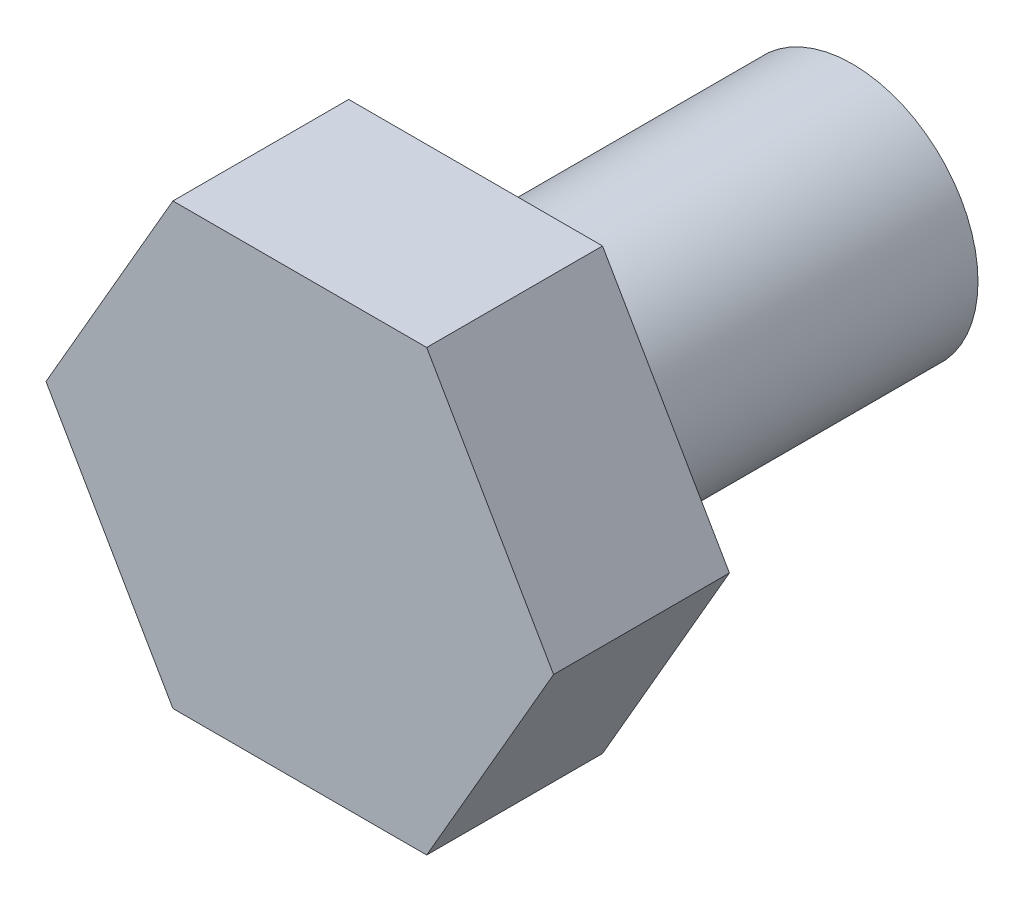
ISO-10303-21;
HEADER;
FILE_DESCRIPTION(('STEP AP214'),'2;1');
FILE_NAME('part.step','',(''),(''),'','','');
FILE_SCHEMA(('AUTOMOTIVE_DESIGN { 1 0 10303 214 1 1 1 1 }'));
ENDSEC;
DATA;
#1=APPLICATION_CONTEXT('core data for automotive mechanical design processes');
#2=APPLICATION_PROTOCOL_DEFINITION('international standard','automotive_design',2000,#1);
#3=PRODUCT_CONTEXT('',#1,'mechanical');
#4=PRODUCT('Part','Part','',(#3));
#5=PRODUCT_RELATED_PRODUCT_CATEGORY('part','',(#4));
#6=PRODUCT_DEFINITION_FORMATION('','',#4);
#7=PRODUCT_DEFINITION_CONTEXT('part definition',#1,'design');
#8=PRODUCT_DEFINITION('design','',#6,#7);
#9=PRODUCT_DEFINITION_SHAPE('','',#8);
#10=(LENGTH_UNIT() NAMED_UNIT(*) SI_UNIT(.MILLI.,.METRE.));
#11=(NAMED_UNIT(*) PLANE_ANGLE_UNIT() SI_UNIT($,.RADIAN.));
#12=(NAMED_UNIT(*) SI_UNIT($,.STERADIAN.) SOLID_ANGLE_UNIT());
#13=UNCERTAINTY_MEASURE_WITH_UNIT(LENGTH_MEASURE(1.E-05),#10,'distance_accuracy_value','');
#14=(GEOMETRIC_REPRESENTATION_CONTEXT(3) GLOBAL_UNCERTAINTY_ASSIGNED_CONTEXT((#13)) GLOBAL_UNIT_ASSIGNED_CONTEXT((#10,
#11,#12)) REPRESENTATION_CONTEXT('',''));
#15=CARTESIAN_POINT('',(0.,0.,0.));
#16=DIRECTION('',(0.,0.,1.));
#17=DIRECTION('',(1.,0.,0.));
#18=AXIS2_PLACEMENT_3D('',#15,#16,#17);
#19=CARTESIAN_POINT('',(0.,0.,-6.));
#20=DIRECTION('',(0.,0.,1.));
#21=DIRECTION('',(1.,0.,0.));
#22=AXIS2_PLACEMENT_3D('',#19,#20,#21);
#23=CYLINDRICAL_SURFACE('',#22,2.);
#24=CARTESIAN_POINT('',(0.,0.,-6.));
#25=DIRECTION('',(0.,0.,1.));
#26=DIRECTION('',(1.,0.,0.));
#27=AXIS2_PLACEMENT_3D('',#24,#25,#26);
#28=CIRCLE('',#27,2.);
#29=CARTESIAN_POINT('',(2.,0.,-6.));
#30=VERTEX_POINT('',#29);
#31=EDGE_CURVE('E11',#30,#30,#28,.T.);
#32=ORIENTED_EDGE('',*,*,#31,.T.);
#33=EDGE_LOOP('',(#32));
#34=FACE_BOUND('',#33,.T.);
#35=CARTESIAN_POINT('',(0.,0.,0.));
#36=DIRECTION('',(0.,0.,1.));
#37=DIRECTION('',(1.,0.,0.));
#38=AXIS2_PLACEMENT_3D('',#35,#36,#37);
#39=CIRCLE('',#38,2.);
#40=CARTESIAN_POINT('',(2.,0.,0.));
#41=VERTEX_POINT('',#40);
#42=EDGE_CURVE('E37',#41,#41,#39,.T.);
#43=ORIENTED_EDGE('',*,*,#42,.F.);
#44=EDGE_LOOP('',(#43));
#45=FACE_BOUND('',#44,.T.);
#46=ADVANCED_FACE('F34',(#34,#45),#23,.T.);
#47=CARTESIAN_POINT('',(0.,0.,-6.));
#48=DIRECTION('',(0.,0.,1.));
#49=DIRECTION('',(1.,0.,0.));
#50=AXIS2_PLACEMENT_3D('',#47,#48,#49);
#51=PLANE('',#50);
#52=ORIENTED_EDGE('',*,*,#31,.F.);
#53=EDGE_LOOP('',(#52));
#54=FACE_BOUND('',#53,.T.);
#55=ADVANCED_FACE('F145',(#54),#51,.F.);
#56=CARTESIAN_POINT('',(2.02072594216369,3.5,2.8));
#57=DIRECTION('',(0.,-1.,0.));
#58=DIRECTION('',(0.,0.,-1.));
#59=AXIS2_PLACEMENT_3D('',#56,#57,#58);
#60=PLANE('',#59);
#61=DIRECTION('',(-1.,0.,0.));
#62=VECTOR('',#61,1.);
#63=CARTESIAN_POINT('',(2.02072594216369,3.5,0.));
#64=LINE('',#63,#62);
#65=CARTESIAN_POINT('',(2.02072594216369,3.5,0.));
#66=VERTEX_POINT('',#65);
#67=CARTESIAN_POINT('',(-2.02072594216369,3.5,0.));
#68=VERTEX_POINT('',#67);
#69=EDGE_CURVE('E119',#66,#68,#64,.T.);
#70=ORIENTED_EDGE('',*,*,#69,.T.);
#71=DIRECTION('',(0.,0.,-1.));
#72=VECTOR('',#71,1.);
#73=CARTESIAN_POINT('',(-2.02072594216369,3.5,2.8));
#74=LINE('',#73,#72);
#75=CARTESIAN_POINT('',(-2.02072594216369,3.5,2.8));
#76=VERTEX_POINT('',#75);
#77=EDGE_CURVE('E136',#76,#68,#74,.T.);
#78=ORIENTED_EDGE('',*,*,#77,.F.);
#79=DIRECTION('',(-1.,0.,0.));
#80=VECTOR('',#79,1.);
#81=CARTESIAN_POINT('',(2.02072594216369,3.5,2.8));
#82=LINE('',#81,#80);
#83=CARTESIAN_POINT('',(2.02072594216369,3.5,2.8));
#84=VERTEX_POINT('',#83);
#85=EDGE_CURVE('E129',#84,#76,#82,.T.);
#86=ORIENTED_EDGE('',*,*,#85,.F.);
#87=DIRECTION('',(0.,0.,-1.));
#88=VECTOR('',#87,1.);
#89=CARTESIAN_POINT('',(2.02072594216369,3.5,2.8));
#90=LINE('',#89,#88);
#91=EDGE_CURVE('E115',#84,#66,#90,.T.);
#92=ORIENTED_EDGE('',*,*,#91,.T.);
#93=EDGE_LOOP('',(#70,#78,#86,#92));
#94=FACE_BOUND('',#93,.T.);
#95=ADVANCED_FACE('F150',(#94),#60,.F.);
#96=CARTESIAN_POINT('',(-2.02072594216369,3.5,2.8));
#97=DIRECTION('',(0.866025403784439,-0.5,0.));
#98=DIRECTION('',(0.5,0.866025403784439,0.));
#99=AXIS2_PLACEMENT_3D('',#96,#97,#98);
#100=PLANE('',#99);
#101=DIRECTION('',(-0.5,-0.866025403784439,0.));
#102=VECTOR('',#101,1.);
#103=CARTESIAN_POINT('',(-2.02072594216369,3.5,0.));
#104=LINE('',#103,#102);
#105=CARTESIAN_POINT('',(-4.04145188432738,0.,0.));
#106=VERTEX_POINT('',#105);
#107=EDGE_CURVE('E122',#68,#106,#104,.T.);
#108=ORIENTED_EDGE('',*,*,#107,.T.);
#109=DIRECTION('',(0.,0.,-1.));
#110=VECTOR('',#109,1.);
#111=CARTESIAN_POINT('',(-4.04145188432738,0.,2.8));
#112=LINE('',#111,#110);
#113=CARTESIAN_POINT('',(-4.04145188432738,0.,2.8));
#114=VERTEX_POINT('',#113);
#115=EDGE_CURVE('E133',#114,#106,#112,.T.);
#116=ORIENTED_EDGE('',*,*,#115,.F.);
#117=DIRECTION('',(-0.5,-0.866025403784439,0.));
#118=VECTOR('',#117,1.);
#119=CARTESIAN_POINT('',(-2.02072594216369,3.5,2.8));
#120=LINE('',#119,#118);
#121=EDGE_CURVE('E88',#76,#114,#120,.T.);
#122=ORIENTED_EDGE('',*,*,#121,.F.);
#123=ORIENTED_EDGE('',*,*,#77,.T.);
#124=EDGE_LOOP('',(#108,#116,#122,#123));
#125=FACE_BOUND('',#124,.T.);
#126=ADVANCED_FACE('F156',(#125),#100,.F.);
#127=CARTESIAN_POINT('',(-4.04145188432738,0.,2.8));
#128=DIRECTION('',(0.866025403784439,0.5,0.));
#129=DIRECTION('',(-0.5,0.866025403784439,0.));
#130=AXIS2_PLACEMENT_3D('',#127,#128,#129);
#131=PLANE('',#130);
#132=DIRECTION('',(0.5,-0.866025403784439,0.));
#133=VECTOR('',#132,1.);
#134=CARTESIAN_POINT('',(-4.04145188432738,0.,0.));
#135=LINE('',#134,#133);
#136=CARTESIAN_POINT('',(-2.02072594216369,-3.5,0.));
#137=VERTEX_POINT('',#136);
#138=EDGE_CURVE('E124',#106,#137,#135,.T.);
#139=ORIENTED_EDGE('',*,*,#138,.T.);
#140=DIRECTION('',(0.,0.,-1.));
#141=VECTOR('',#140,1.);
#142=CARTESIAN_POINT('',(-2.02072594216369,-3.5,2.8));
#143=LINE('',#142,#141);
#144=CARTESIAN_POINT('',(-2.02072594216369,-3.5,2.8));
#145=VERTEX_POINT('',#144);
#146=EDGE_CURVE('E110',#145,#137,#143,.T.);
#147=ORIENTED_EDGE('',*,*,#146,.F.);
#148=DIRECTION('',(0.5,-0.866025403784439,0.));
#149=VECTOR('',#148,1.);
#150=CARTESIAN_POINT('',(-4.04145188432738,0.,2.8));
#151=LINE('',#150,#149);
#152=EDGE_CURVE('E101',#114,#145,#151,.T.);
#153=ORIENTED_EDGE('',*,*,#152,.F.);
#154=ORIENTED_EDGE('',*,*,#115,.T.);
#155=EDGE_LOOP('',(#139,#147,#153,#154));
#156=FACE_BOUND('',#155,.T.);
#157=ADVANCED_FACE('F162',(#156),#131,.F.);
#158=CARTESIAN_POINT('',(-2.02072594216369,-3.5,2.8));
#159=DIRECTION('',(0.,1.,0.));
#160=DIRECTION('',(0.,0.,1.));
#161=AXIS2_PLACEMENT_3D('',#158,#159,#160);
#162=PLANE('',#161);
#163=DIRECTION('',(1.,0.,0.));
#164=VECTOR('',#163,1.);
#165=CARTESIAN_POINT('',(-2.02072594216369,-3.5,0.));
#166=LINE('',#165,#164);
#167=CARTESIAN_POINT('',(2.02072594216369,-3.5,0.));
#168=VERTEX_POINT('',#167);
#169=EDGE_CURVE('E109',#137,#168,#166,.T.);
#170=ORIENTED_EDGE('',*,*,#169,.T.);
#171=DIRECTION('',(0.,0.,-1.));
#172=VECTOR('',#171,1.);
#173=CARTESIAN_POINT('',(2.02072594216369,-3.5,2.8));
#174=LINE('',#173,#172);
#175=CARTESIAN_POINT('',(2.02072594216369,-3.5,2.8));
#176=VERTEX_POINT('',#175);
#177=EDGE_CURVE('E106',#176,#168,#174,.T.);
#178=ORIENTED_EDGE('',*,*,#177,.F.);
#179=DIRECTION('',(1.,0.,0.));
#180=VECTOR('',#179,1.);
#181=CARTESIAN_POINT('',(-2.02072594216369,-3.5,2.8));
#182=LINE('',#181,#180);
#183=EDGE_CURVE('E95',#145,#176,#182,.T.);
#184=ORIENTED_EDGE('',*,*,#183,.F.);
#185=ORIENTED_EDGE('',*,*,#146,.T.);
#186=EDGE_LOOP('',(#170,#178,#184,#185));
#187=FACE_BOUND('',#186,.T.);
#188=ADVANCED_FACE('F107',(#187),#162,.F.);
#189=CARTESIAN_POINT('',(2.02072594216369,-3.5,2.8));
#190=DIRECTION('',(-0.866025403784439,0.5,0.));
#191=DIRECTION('',(-0.5,-0.866025403784439,0.));
#192=AXIS2_PLACEMENT_3D('',#189,#190,#191);
#193=PLANE('',#192);
#194=DIRECTION('',(0.5,0.866025403784439,0.));
#195=VECTOR('',#194,1.);
#196=CARTESIAN_POINT('',(2.02072594216369,-3.5,0.));
#197=LINE('',#196,#195);
#198=CARTESIAN_POINT('',(4.04145188432738,0.,0.));
#199=VERTEX_POINT('',#198);
#200=EDGE_CURVE('E73',#168,#199,#197,.T.);
#201=ORIENTED_EDGE('',*,*,#200,.T.);
#202=DIRECTION('',(0.,0.,-1.));
#203=VECTOR('',#202,1.);
#204=CARTESIAN_POINT('',(4.04145188432738,0.,2.8));
#205=LINE('',#204,#203);
#206=CARTESIAN_POINT('',(4.04145188432738,0.,2.8));
#207=VERTEX_POINT('',#206);
#208=EDGE_CURVE('E111',#207,#199,#205,.T.);
#209=ORIENTED_EDGE('',*,*,#208,.F.);
#210=DIRECTION('',(0.5,0.866025403784439,0.));
#211=VECTOR('',#210,1.);
#212=CARTESIAN_POINT('',(2.02072594216369,-3.5,2.8));
#213=LINE('',#212,#211);
#214=EDGE_CURVE('E99',#176,#207,#213,.T.);
#215=ORIENTED_EDGE('',*,*,#214,.F.);
#216=ORIENTED_EDGE('',*,*,#177,.T.);
#217=EDGE_LOOP('',(#201,#209,#215,#216));
#218=FACE_BOUND('',#217,.T.);
#219=ADVANCED_FACE('F113',(#218),#193,.F.);
#220=CARTESIAN_POINT('',(4.04145188432738,0.,2.8));
#221=DIRECTION('',(-0.866025403784439,-0.5,0.));
#222=DIRECTION('',(0.5,-0.866025403784439,0.));
#223=AXIS2_PLACEMENT_3D('',#220,#221,#222);
#224=PLANE('',#223);
#225=DIRECTION('',(-0.5,0.866025403784439,0.));
#226=VECTOR('',#225,1.);
#227=CARTESIAN_POINT('',(4.04145188432738,0.,0.));
#228=LINE('',#227,#226);
#229=EDGE_CURVE('E79',#199,#66,#228,.T.);
#230=ORIENTED_EDGE('',*,*,#229,.T.);
#231=ORIENTED_EDGE('',*,*,#91,.F.);
#232=DIRECTION('',(-0.5,0.866025403784439,0.));
#233=VECTOR('',#232,1.);
#234=CARTESIAN_POINT('',(4.04145188432738,0.,2.8));
#235=LINE('',#234,#233);
#236=EDGE_CURVE('E50',#207,#84,#235,.T.);
#237=ORIENTED_EDGE('',*,*,#236,.F.);
#238=ORIENTED_EDGE('',*,*,#208,.T.);
#239=EDGE_LOOP('',(#230,#231,#237,#238));
#240=FACE_BOUND('',#239,.T.);
#241=ADVANCED_FACE('F170',(#240),#224,.F.);
#242=CARTESIAN_POINT('',(-6.06217782649107,3.5,2.8));
#243=DIRECTION('',(0.,0.,1.));
#244=DIRECTION('',(1.,0.,0.));
#245=AXIS2_PLACEMENT_3D('',#242,#243,#244);
#246=PLANE('',#245);
#247=ORIENTED_EDGE('',*,*,#85,.T.);
#248=ORIENTED_EDGE('',*,*,#121,.T.);
#249=ORIENTED_EDGE('',*,*,#152,.T.);
#250=ORIENTED_EDGE('',*,*,#183,.T.);
#251=ORIENTED_EDGE('',*,*,#214,.T.);
#252=ORIENTED_EDGE('',*,*,#236,.T.);
#253=EDGE_LOOP('',(#247,#248,#249,#250,#251,#252));
#254=FACE_BOUND('',#253,.T.);
#255=ADVANCED_FACE('F97',(#254),#246,.T.);
#256=CARTESIAN_POINT('',(-6.06217782649107,3.5,0.));
#257=DIRECTION('',(0.,0.,1.));
#258=DIRECTION('',(1.,0.,0.));
#259=AXIS2_PLACEMENT_3D('',#256,#257,#258);
#260=PLANE('',#259);
#261=ORIENTED_EDGE('',*,*,#42,.T.);
#262=EDGE_LOOP('',(#261));
#263=FACE_BOUND('',#262,.T.);
#264=ORIENTED_EDGE('',*,*,#69,.F.);
#265=ORIENTED_EDGE('',*,*,#229,.F.);
#266=ORIENTED_EDGE('',*,*,#200,.F.);
#267=ORIENTED_EDGE('',*,*,#169,.F.);
#268=ORIENTED_EDGE('',*,*,#138,.F.);
#269=ORIENTED_EDGE('',*,*,#107,.F.);
#270=EDGE_LOOP('',(#264,#265,#266,#267,#268,#269));
#271=FACE_BOUND('',#270,.T.);
#272=ADVANCED_FACE('F141',(#263,#271),#260,.F.);
#273=CLOSED_SHELL('',(#46,#55,#95,#126,#157,#188,#219,#241,#255,#272));
#274=MANIFOLD_SOLID_BREP('B2',#273);
#275=ADVANCED_BREP_SHAPE_REPRESENTATION('',(#18,#274),#14);
#276=SHAPE_DEFINITION_REPRESENTATION(#9,#275);
ENDSEC;
END-ISO-10303-21;
